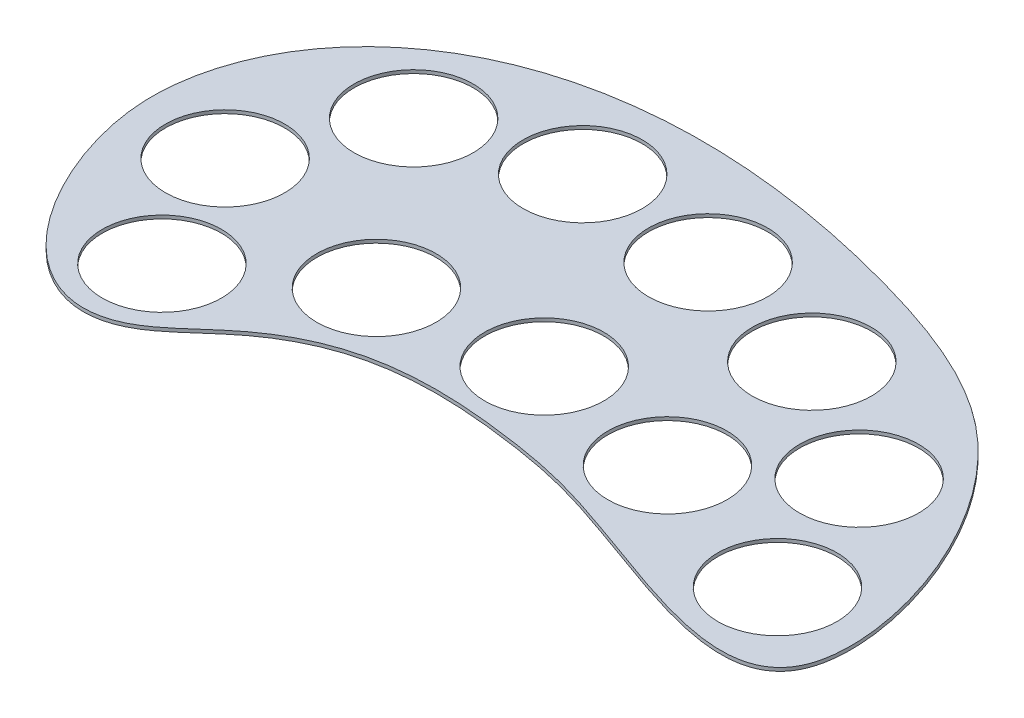
ISO-10303-21;
HEADER;
FILE_DESCRIPTION(('STEP AP214'),'2;1');
FILE_NAME('part.step','',(''),(''),'','','');
FILE_SCHEMA(('AUTOMOTIVE_DESIGN { 1 0 10303 214 1 1 1 1 }'));
ENDSEC;
DATA;
#1=APPLICATION_CONTEXT('core data for automotive mechanical design processes');
#2=APPLICATION_PROTOCOL_DEFINITION('international standard','automotive_design',2000,#1);
#3=PRODUCT_CONTEXT('',#1,'mechanical');
#4=PRODUCT('Part','Part','',(#3));
#5=PRODUCT_RELATED_PRODUCT_CATEGORY('part','',(#4));
#6=PRODUCT_DEFINITION_FORMATION('','',#4);
#7=PRODUCT_DEFINITION_CONTEXT('part definition',#1,'design');
#8=PRODUCT_DEFINITION('design','',#6,#7);
#9=PRODUCT_DEFINITION_SHAPE('','',#8);
#10=(LENGTH_UNIT() NAMED_UNIT(*) SI_UNIT(.MILLI.,.METRE.));
#11=(NAMED_UNIT(*) PLANE_ANGLE_UNIT() SI_UNIT($,.RADIAN.));
#12=(NAMED_UNIT(*) SI_UNIT($,.STERADIAN.) SOLID_ANGLE_UNIT());
#13=UNCERTAINTY_MEASURE_WITH_UNIT(LENGTH_MEASURE(1.E-05),#10,'distance_accuracy_value','');
#14=(GEOMETRIC_REPRESENTATION_CONTEXT(3) GLOBAL_UNCERTAINTY_ASSIGNED_CONTEXT((#13)) GLOBAL_UNIT_ASSIGNED_CONTEXT((#10,
#11,#12)) REPRESENTATION_CONTEXT('',''));
#15=CARTESIAN_POINT('',(0.,0.,0.));
#16=DIRECTION('',(0.,0.,1.));
#17=DIRECTION('',(1.,0.,0.));
#18=AXIS2_PLACEMENT_3D('',#15,#16,#17);
#19=CARTESIAN_POINT('',(684.135933031641,3.175,-50.0286677488228));
#20=DIRECTION('',(0.,1.,0.));
#21=DIRECTION('',(0.,0.,1.));
#22=AXIS2_PLACEMENT_3D('',#19,#20,#21);
#23=PLANE('',#22);
#24=CARTESIAN_POINT('',(710.382975865013,3.175,-120.032071340773));
#25=DIRECTION('',(0.,1.,0.));
#26=DIRECTION('',(0.,0.,1.));
#27=AXIS2_PLACEMENT_3D('',#24,#25,#26);
#28=CIRCLE('',#27,55.8800000000001);
#29=CARTESIAN_POINT('',(710.382975865013,3.175,-64.1520713407733));
#30=VERTEX_POINT('',#29);
#31=EDGE_CURVE('E103',#30,#30,#28,.T.);
#32=ORIENTED_EDGE('',*,*,#31,.F.);
#33=EDGE_LOOP('',(#32));
#34=FACE_BOUND('',#33,.T.);
#35=CARTESIAN_POINT('',(543.435128324721,3.175,-319.215089932941));
#36=DIRECTION('',(0.,1.,0.));
#37=DIRECTION('',(0.,0.,1.));
#38=AXIS2_PLACEMENT_3D('',#35,#36,#37);
#39=CIRCLE('',#38,55.88);
#40=CARTESIAN_POINT('',(543.435128324721,3.175,-263.335089932941));
#41=VERTEX_POINT('',#40);
#42=EDGE_CURVE('E91',#41,#41,#39,.T.);
#43=ORIENTED_EDGE('',*,*,#42,.F.);
#44=EDGE_LOOP('',(#43));
#45=FACE_BOUND('',#44,.T.);
#46=CARTESIAN_POINT('',(421.949796134147,3.175,-189.836190597731));
#47=DIRECTION('',(0.,1.,0.));
#48=DIRECTION('',(0.,0.,1.));
#49=AXIS2_PLACEMENT_3D('',#46,#47,#48);
#50=CIRCLE('',#49,55.88);
#51=CARTESIAN_POINT('',(421.949796134147,3.175,-133.956190597731));
#52=VERTEX_POINT('',#51);
#53=EDGE_CURVE('E79',#52,#52,#50,.T.);
#54=ORIENTED_EDGE('',*,*,#53,.F.);
#55=EDGE_LOOP('',(#54));
#56=FACE_BOUND('',#55,.T.);
#57=CARTESIAN_POINT('',(283.803786214023,3.175,-364.017449024033));
#58=DIRECTION('',(0.,1.,0.));
#59=DIRECTION('',(0.,0.,1.));
#60=AXIS2_PLACEMENT_3D('',#57,#58,#59);
#61=CIRCLE('',#60,55.8800000000001);
#62=CARTESIAN_POINT('',(283.803786214023,3.175,-308.137449024033));
#63=VERTEX_POINT('',#62);
#64=EDGE_CURVE('E67',#63,#63,#61,.T.);
#65=ORIENTED_EDGE('',*,*,#64,.F.);
#66=EDGE_LOOP('',(#65));
#67=FACE_BOUND('',#66,.T.);
#68=CARTESIAN_POINT('',(159.211353128381,3.175,-330.134918328895));
#69=DIRECTION('',(0.,1.,0.));
#70=DIRECTION('',(0.,0.,1.));
#71=AXIS2_PLACEMENT_3D('',#68,#69,#70);
#72=CIRCLE('',#71,55.88);
#73=CARTESIAN_POINT('',(159.211353128381,3.175,-274.254918328895));
#74=VERTEX_POINT('',#73);
#75=EDGE_CURVE('E55',#74,#74,#72,.T.);
#76=ORIENTED_EDGE('',*,*,#75,.F.);
#77=EDGE_LOOP('',(#76));
#78=FACE_BOUND('',#77,.T.);
#79=CARTESIAN_POINT('',(18.90929656579,3.175,-218.738303536017));
#80=CARTESIAN_POINT('',(19.3137804175349,3.175,-207.303001363422));
#81=CARTESIAN_POINT('',(32.3627941964965,3.175,-105.603551285262));
#82=CARTESIAN_POINT('',(136.614276413427,3.175,37.6468143892049));
#83=CARTESIAN_POINT('',(287.885062402203,3.175,-119.177890449448));
#84=CARTESIAN_POINT('',(386.65177229118,3.175,-129.233236426815));
#85=CARTESIAN_POINT('',(593.931834544514,3.175,-92.5019488812406));
#86=CARTESIAN_POINT('',(863.777298493397,3.175,56.2509725707286));
#87=CARTESIAN_POINT('',(744.910717156489,3.175,-338.443232461618));
#88=CARTESIAN_POINT('',(183.656780139511,3.175,-538.233183068478));
#89=CARTESIAN_POINT('',(14.0176674492187,3.175,-357.031233706032));
#90=CARTESIAN_POINT('',(18.90929656579,3.175,-218.738303536017));
#91=B_SPLINE_CURVE_WITH_KNOTS('',3,(#79,#80,#81,#82,#83,#84,#85,#86,#87,#88,#89,#90),
.UNSPECIFIED.,.T.,.F.,(4,1,1,1,1,1,1,1,1,4),(0.,0.0247150068666619,0.222435061799958,
0.264927020809992,0.407142637956969,0.438731727428566,0.563040963382589,0.657412937436147,
0.701108841097887,0.999999999999997),.UNSPECIFIED.);
#92=CARTESIAN_POINT('',(18.90929656579,3.175,-218.738303536017));
#93=VERTEX_POINT('',#92);
#94=EDGE_CURVE('E10',#93,#93,#91,.T.);
#95=ORIENTED_EDGE('',*,*,#94,.T.);
#96=EDGE_LOOP('',(#95));
#97=FACE_BOUND('',#96,.T.);
#98=CARTESIAN_POINT('',(103.376977842753,3.175,-209.224559200817));
#99=DIRECTION('',(0.,1.,0.));
#100=DIRECTION('',(0.,0.,1.));
#101=AXIS2_PLACEMENT_3D('',#98,#99,#100);
#102=CIRCLE('',#101,55.88);
#103=CARTESIAN_POINT('',(103.376977842753,3.175,-153.344559200817));
#104=VERTEX_POINT('',#103);
#105=EDGE_CURVE('E44',#104,#104,#102,.T.);
#106=ORIENTED_EDGE('',*,*,#105,.F.);
#107=EDGE_LOOP('',(#106));
#108=FACE_BOUND('',#107,.T.);
#109=CARTESIAN_POINT('',(279.457854567624,3.175,-174.984117895221));
#110=DIRECTION('',(0.,1.,0.));
#111=DIRECTION('',(0.,0.,1.));
#112=AXIS2_PLACEMENT_3D('',#109,#110,#111);
#113=CIRCLE('',#112,55.88);
#114=CARTESIAN_POINT('',(279.457854567624,3.175,-119.104117895221));
#115=VERTEX_POINT('',#114);
#116=EDGE_CURVE('E61',#115,#115,#113,.T.);
#117=ORIENTED_EDGE('',*,*,#116,.F.);
#118=EDGE_LOOP('',(#117));
#119=FACE_BOUND('',#118,.T.);
#120=CARTESIAN_POINT('',(559.919680471523,3.175,-167.353163273532));
#121=DIRECTION('',(0.,1.,0.));
#122=DIRECTION('',(0.,0.,1.));
#123=AXIS2_PLACEMENT_3D('',#120,#121,#122);
#124=CIRCLE('',#123,55.8800000000001);
#125=CARTESIAN_POINT('',(559.919680471523,3.175,-111.473163273532));
#126=VERTEX_POINT('',#125);
#127=EDGE_CURVE('E73',#126,#126,#124,.T.);
#128=ORIENTED_EDGE('',*,*,#127,.F.);
#129=EDGE_LOOP('',(#128));
#130=FACE_BOUND('',#129,.T.);
#131=CARTESIAN_POINT('',(159.211353128381,3.175,-94.1120140955718));
#132=DIRECTION('',(0.,1.,0.));
#133=DIRECTION('',(0.,0.,1.));
#134=AXIS2_PLACEMENT_3D('',#131,#132,#133);
#135=CIRCLE('',#134,55.88);
#136=CARTESIAN_POINT('',(159.211353128381,3.175,-38.2320140955718));
#137=VERTEX_POINT('',#136);
#138=EDGE_CURVE('E85',#137,#137,#135,.T.);
#139=ORIENTED_EDGE('',*,*,#138,.F.);
#140=EDGE_LOOP('',(#139));
#141=FACE_BOUND('',#140,.T.);
#142=CARTESIAN_POINT('',(414.188977652437,3.175,-351.229411635359));
#143=DIRECTION('',(0.,1.,0.));
#144=DIRECTION('',(0.,0.,1.));
#145=AXIS2_PLACEMENT_3D('',#142,#143,#144);
#146=CIRCLE('',#145,55.8800000000001);
#147=CARTESIAN_POINT('',(414.188977652437,3.175,-295.349411635359));
#148=VERTEX_POINT('',#147);
#149=EDGE_CURVE('E97',#148,#148,#146,.T.);
#150=ORIENTED_EDGE('',*,*,#149,.F.);
#151=EDGE_LOOP('',(#150));
#152=FACE_BOUND('',#151,.T.);
#153=CARTESIAN_POINT('',(660.583586304874,3.175,-246.394891073436));
#154=DIRECTION('',(0.,1.,0.));
#155=DIRECTION('',(0.,0.,1.));
#156=AXIS2_PLACEMENT_3D('',#153,#154,#155);
#157=CIRCLE('',#156,55.8800000000001);
#158=CARTESIAN_POINT('',(660.583586304874,3.175,-190.514891073436));
#159=VERTEX_POINT('',#158);
#160=EDGE_CURVE('E109',#159,#159,#157,.T.);
#161=ORIENTED_EDGE('',*,*,#160,.F.);
#162=EDGE_LOOP('',(#161));
#163=FACE_BOUND('',#162,.T.);
#164=ADVANCED_FACE('F31',(#34,#45,#56,#67,#78,#97,#108,#119,#130,#141,#152,#163),#23,.T.);
#165=CARTESIAN_POINT('',(684.135933031641,0.,-50.0286677488228));
#166=DIRECTION('',(0.,1.,0.));
#167=DIRECTION('',(0.,0.,1.));
#168=AXIS2_PLACEMENT_3D('',#165,#166,#167);
#169=PLANE('',#168);
#170=CARTESIAN_POINT('',(710.382975865013,0.,-120.032071340773));
#171=DIRECTION('',(0.,1.,0.));
#172=DIRECTION('',(0.,0.,1.));
#173=AXIS2_PLACEMENT_3D('',#170,#171,#172);
#174=CIRCLE('',#173,55.8800000000001);
#175=CARTESIAN_POINT('',(710.382975865013,0.,-64.1520713407733));
#176=VERTEX_POINT('',#175);
#177=EDGE_CURVE('E106',#176,#176,#174,.T.);
#178=ORIENTED_EDGE('',*,*,#177,.T.);
#179=EDGE_LOOP('',(#178));
#180=FACE_BOUND('',#179,.T.);
#181=CARTESIAN_POINT('',(543.435128324721,0.,-319.215089932941));
#182=DIRECTION('',(0.,1.,0.));
#183=DIRECTION('',(0.,0.,1.));
#184=AXIS2_PLACEMENT_3D('',#181,#182,#183);
#185=CIRCLE('',#184,55.88);
#186=CARTESIAN_POINT('',(543.435128324721,0.,-263.335089932941));
#187=VERTEX_POINT('',#186);
#188=EDGE_CURVE('E94',#187,#187,#185,.T.);
#189=ORIENTED_EDGE('',*,*,#188,.T.);
#190=EDGE_LOOP('',(#189));
#191=FACE_BOUND('',#190,.T.);
#192=CARTESIAN_POINT('',(421.949796134147,0.,-189.836190597731));
#193=DIRECTION('',(0.,1.,0.));
#194=DIRECTION('',(0.,0.,1.));
#195=AXIS2_PLACEMENT_3D('',#192,#193,#194);
#196=CIRCLE('',#195,55.88);
#197=CARTESIAN_POINT('',(421.949796134147,0.,-133.956190597731));
#198=VERTEX_POINT('',#197);
#199=EDGE_CURVE('E82',#198,#198,#196,.T.);
#200=ORIENTED_EDGE('',*,*,#199,.T.);
#201=EDGE_LOOP('',(#200));
#202=FACE_BOUND('',#201,.T.);
#203=CARTESIAN_POINT('',(283.803786214023,0.,-364.017449024033));
#204=DIRECTION('',(0.,1.,0.));
#205=DIRECTION('',(0.,0.,1.));
#206=AXIS2_PLACEMENT_3D('',#203,#204,#205);
#207=CIRCLE('',#206,55.8800000000001);
#208=CARTESIAN_POINT('',(283.803786214023,0.,-308.137449024033));
#209=VERTEX_POINT('',#208);
#210=EDGE_CURVE('E70',#209,#209,#207,.T.);
#211=ORIENTED_EDGE('',*,*,#210,.T.);
#212=EDGE_LOOP('',(#211));
#213=FACE_BOUND('',#212,.T.);
#214=CARTESIAN_POINT('',(159.211353128381,0.,-330.134918328895));
#215=DIRECTION('',(0.,1.,0.));
#216=DIRECTION('',(0.,0.,1.));
#217=AXIS2_PLACEMENT_3D('',#214,#215,#216);
#218=CIRCLE('',#217,55.88);
#219=CARTESIAN_POINT('',(159.211353128381,0.,-274.254918328895));
#220=VERTEX_POINT('',#219);
#221=EDGE_CURVE('E58',#220,#220,#218,.T.);
#222=ORIENTED_EDGE('',*,*,#221,.T.);
#223=EDGE_LOOP('',(#222));
#224=FACE_BOUND('',#223,.T.);
#225=CARTESIAN_POINT('',(18.90929656579,0.,-218.738303536017));
#226=CARTESIAN_POINT('',(19.3137804175349,0.,-207.303001363422));
#227=CARTESIAN_POINT('',(32.3627941964965,0.,-105.603551285262));
#228=CARTESIAN_POINT('',(136.614276413427,0.,37.6468143892049));
#229=CARTESIAN_POINT('',(287.885062402203,0.,-119.177890449448));
#230=CARTESIAN_POINT('',(386.65177229118,0.,-129.233236426815));
#231=CARTESIAN_POINT('',(593.931834544514,0.,-92.5019488812406));
#232=CARTESIAN_POINT('',(863.777298493397,0.,56.2509725707286));
#233=CARTESIAN_POINT('',(744.910717156489,0.,-338.443232461618));
#234=CARTESIAN_POINT('',(183.656780139511,0.,-538.233183068478));
#235=CARTESIAN_POINT('',(14.0176674492187,0.,-357.031233706032));
#236=CARTESIAN_POINT('',(18.90929656579,0.,-218.738303536017));
#237=B_SPLINE_CURVE_WITH_KNOTS('',3,(#225,#226,#227,#228,#229,#230,#231,#232,#233,#234,#235,
#236),.UNSPECIFIED.,.T.,.F.,(4,1,1,1,1,1,1,1,1,4),(0.,0.0247150068666619,0.222435061799958,
0.264927020809992,0.407142637956969,0.438731727428566,0.563040963382589,0.657412937436147,
0.701108841097887,0.999999999999997),.UNSPECIFIED.);
#238=CARTESIAN_POINT('',(18.90929656579,0.,-218.738303536017));
#239=VERTEX_POINT('',#238);
#240=EDGE_CURVE('E36',#239,#239,#237,.T.);
#241=ORIENTED_EDGE('',*,*,#240,.F.);
#242=EDGE_LOOP('',(#241));
#243=FACE_BOUND('',#242,.T.);
#244=CARTESIAN_POINT('',(103.376977842753,0.,-209.224559200817));
#245=DIRECTION('',(0.,1.,0.));
#246=DIRECTION('',(0.,0.,1.));
#247=AXIS2_PLACEMENT_3D('',#244,#245,#246);
#248=CIRCLE('',#247,55.88);
#249=CARTESIAN_POINT('',(103.376977842753,0.,-153.344559200817));
#250=VERTEX_POINT('',#249);
#251=EDGE_CURVE('E49',#250,#250,#248,.T.);
#252=ORIENTED_EDGE('',*,*,#251,.T.);
#253=EDGE_LOOP('',(#252));
#254=FACE_BOUND('',#253,.T.);
#255=CARTESIAN_POINT('',(279.457854567624,0.,-174.984117895221));
#256=DIRECTION('',(0.,1.,0.));
#257=DIRECTION('',(0.,0.,1.));
#258=AXIS2_PLACEMENT_3D('',#255,#256,#257);
#259=CIRCLE('',#258,55.88);
#260=CARTESIAN_POINT('',(279.457854567624,0.,-119.104117895221));
#261=VERTEX_POINT('',#260);
#262=EDGE_CURVE('E64',#261,#261,#259,.T.);
#263=ORIENTED_EDGE('',*,*,#262,.T.);
#264=EDGE_LOOP('',(#263));
#265=FACE_BOUND('',#264,.T.);
#266=CARTESIAN_POINT('',(559.919680471523,0.,-167.353163273532));
#267=DIRECTION('',(0.,1.,0.));
#268=DIRECTION('',(0.,0.,1.));
#269=AXIS2_PLACEMENT_3D('',#266,#267,#268);
#270=CIRCLE('',#269,55.8800000000001);
#271=CARTESIAN_POINT('',(559.919680471523,0.,-111.473163273532));
#272=VERTEX_POINT('',#271);
#273=EDGE_CURVE('E76',#272,#272,#270,.T.);
#274=ORIENTED_EDGE('',*,*,#273,.T.);
#275=EDGE_LOOP('',(#274));
#276=FACE_BOUND('',#275,.T.);
#277=CARTESIAN_POINT('',(159.211353128381,0.,-94.1120140955718));
#278=DIRECTION('',(0.,1.,0.));
#279=DIRECTION('',(0.,0.,1.));
#280=AXIS2_PLACEMENT_3D('',#277,#278,#279);
#281=CIRCLE('',#280,55.88);
#282=CARTESIAN_POINT('',(159.211353128381,0.,-38.2320140955718));
#283=VERTEX_POINT('',#282);
#284=EDGE_CURVE('E88',#283,#283,#281,.T.);
#285=ORIENTED_EDGE('',*,*,#284,.T.);
#286=EDGE_LOOP('',(#285));
#287=FACE_BOUND('',#286,.T.);
#288=CARTESIAN_POINT('',(414.188977652437,0.,-351.229411635359));
#289=DIRECTION('',(0.,1.,0.));
#290=DIRECTION('',(0.,0.,1.));
#291=AXIS2_PLACEMENT_3D('',#288,#289,#290);
#292=CIRCLE('',#291,55.8800000000001);
#293=CARTESIAN_POINT('',(414.188977652437,0.,-295.349411635359));
#294=VERTEX_POINT('',#293);
#295=EDGE_CURVE('E100',#294,#294,#292,.T.);
#296=ORIENTED_EDGE('',*,*,#295,.T.);
#297=EDGE_LOOP('',(#296));
#298=FACE_BOUND('',#297,.T.);
#299=CARTESIAN_POINT('',(660.583586304874,0.,-246.394891073436));
#300=DIRECTION('',(0.,1.,0.));
#301=DIRECTION('',(0.,0.,1.));
#302=AXIS2_PLACEMENT_3D('',#299,#300,#301);
#303=CIRCLE('',#302,55.8800000000001);
#304=CARTESIAN_POINT('',(660.583586304874,0.,-190.514891073436));
#305=VERTEX_POINT('',#304);
#306=EDGE_CURVE('E112',#305,#305,#303,.T.);
#307=ORIENTED_EDGE('',*,*,#306,.T.);
#308=EDGE_LOOP('',(#307));
#309=FACE_BOUND('',#308,.T.);
#310=ADVANCED_FACE('F122',(#180,#191,#202,#213,#224,#243,#254,#265,#276,#287,#298,#309),#169,.F.);
#311=DIRECTION('',(0.,-1.,0.));
#312=VECTOR('',#311,1.);
#313=SURFACE_OF_LINEAR_EXTRUSION('',#91,#312);
#314=ORIENTED_EDGE('',*,*,#94,.F.);
#315=EDGE_LOOP('',(#314));
#316=FACE_BOUND('',#315,.T.);
#317=ORIENTED_EDGE('',*,*,#240,.T.);
#318=EDGE_LOOP('',(#317));
#319=FACE_BOUND('',#318,.T.);
#320=ADVANCED_FACE('F33',(#316,#319),#313,.F.);
#321=CARTESIAN_POINT('',(103.376977842753,3.175,-209.224559200817));
#322=DIRECTION('',(0.,-1.,0.));
#323=DIRECTION('',(0.,0.,-1.));
#324=AXIS2_PLACEMENT_3D('',#321,#322,#323);
#325=CYLINDRICAL_SURFACE('',#324,55.88);
#326=ORIENTED_EDGE('',*,*,#105,.T.);
#327=EDGE_LOOP('',(#326));
#328=FACE_BOUND('',#327,.T.);
#329=ORIENTED_EDGE('',*,*,#251,.F.);
#330=EDGE_LOOP('',(#329));
#331=FACE_BOUND('',#330,.T.);
#332=ADVANCED_FACE('F132',(#328,#331),#325,.F.);
#333=CARTESIAN_POINT('',(159.211353128381,3.175,-330.134918328895));
#334=DIRECTION('',(0.,-1.,0.));
#335=DIRECTION('',(0.,0.,-1.));
#336=AXIS2_PLACEMENT_3D('',#333,#334,#335);
#337=CYLINDRICAL_SURFACE('',#336,55.88);
#338=ORIENTED_EDGE('',*,*,#75,.T.);
#339=EDGE_LOOP('',(#338));
#340=FACE_BOUND('',#339,.T.);
#341=ORIENTED_EDGE('',*,*,#221,.F.);
#342=EDGE_LOOP('',(#341));
#343=FACE_BOUND('',#342,.T.);
#344=ADVANCED_FACE('F135',(#340,#343),#337,.F.);
#345=CARTESIAN_POINT('',(279.457854567624,3.175,-174.984117895221));
#346=DIRECTION('',(0.,-1.,0.));
#347=DIRECTION('',(0.,0.,-1.));
#348=AXIS2_PLACEMENT_3D('',#345,#346,#347);
#349=CYLINDRICAL_SURFACE('',#348,55.88);
#350=ORIENTED_EDGE('',*,*,#116,.T.);
#351=EDGE_LOOP('',(#350));
#352=FACE_BOUND('',#351,.T.);
#353=ORIENTED_EDGE('',*,*,#262,.F.);
#354=EDGE_LOOP('',(#353));
#355=FACE_BOUND('',#354,.T.);
#356=ADVANCED_FACE('F139',(#352,#355),#349,.F.);
#357=CARTESIAN_POINT('',(283.803786214023,3.175,-364.017449024033));
#358=DIRECTION('',(0.,-1.,0.));
#359=DIRECTION('',(0.,0.,-1.));
#360=AXIS2_PLACEMENT_3D('',#357,#358,#359);
#361=CYLINDRICAL_SURFACE('',#360,55.8800000000001);
#362=ORIENTED_EDGE('',*,*,#64,.T.);
#363=EDGE_LOOP('',(#362));
#364=FACE_BOUND('',#363,.T.);
#365=ORIENTED_EDGE('',*,*,#210,.F.);
#366=EDGE_LOOP('',(#365));
#367=FACE_BOUND('',#366,.T.);
#368=ADVANCED_FACE('F143',(#364,#367),#361,.F.);
#369=CARTESIAN_POINT('',(559.919680471523,3.175,-167.353163273532));
#370=DIRECTION('',(0.,-1.,0.));
#371=DIRECTION('',(0.,0.,-1.));
#372=AXIS2_PLACEMENT_3D('',#369,#370,#371);
#373=CYLINDRICAL_SURFACE('',#372,55.8800000000001);
#374=ORIENTED_EDGE('',*,*,#127,.T.);
#375=EDGE_LOOP('',(#374));
#376=FACE_BOUND('',#375,.T.);
#377=ORIENTED_EDGE('',*,*,#273,.F.);
#378=EDGE_LOOP('',(#377));
#379=FACE_BOUND('',#378,.T.);
#380=ADVANCED_FACE('F147',(#376,#379),#373,.F.);
#381=CARTESIAN_POINT('',(421.949796134147,3.175,-189.836190597731));
#382=DIRECTION('',(0.,-1.,0.));
#383=DIRECTION('',(0.,0.,-1.));
#384=AXIS2_PLACEMENT_3D('',#381,#382,#383);
#385=CYLINDRICAL_SURFACE('',#384,55.88);
#386=ORIENTED_EDGE('',*,*,#53,.T.);
#387=EDGE_LOOP('',(#386));
#388=FACE_BOUND('',#387,.T.);
#389=ORIENTED_EDGE('',*,*,#199,.F.);
#390=EDGE_LOOP('',(#389));
#391=FACE_BOUND('',#390,.T.);
#392=ADVANCED_FACE('F151',(#388,#391),#385,.F.);
#393=CARTESIAN_POINT('',(159.211353128381,3.175,-94.1120140955718));
#394=DIRECTION('',(0.,-1.,0.));
#395=DIRECTION('',(0.,0.,-1.));
#396=AXIS2_PLACEMENT_3D('',#393,#394,#395);
#397=CYLINDRICAL_SURFACE('',#396,55.88);
#398=ORIENTED_EDGE('',*,*,#138,.T.);
#399=EDGE_LOOP('',(#398));
#400=FACE_BOUND('',#399,.T.);
#401=ORIENTED_EDGE('',*,*,#284,.F.);
#402=EDGE_LOOP('',(#401));
#403=FACE_BOUND('',#402,.T.);
#404=ADVANCED_FACE('F155',(#400,#403),#397,.F.);
#405=CARTESIAN_POINT('',(543.435128324721,3.175,-319.215089932941));
#406=DIRECTION('',(0.,-1.,0.));
#407=DIRECTION('',(0.,0.,-1.));
#408=AXIS2_PLACEMENT_3D('',#405,#406,#407);
#409=CYLINDRICAL_SURFACE('',#408,55.88);
#410=ORIENTED_EDGE('',*,*,#42,.T.);
#411=EDGE_LOOP('',(#410));
#412=FACE_BOUND('',#411,.T.);
#413=ORIENTED_EDGE('',*,*,#188,.F.);
#414=EDGE_LOOP('',(#413));
#415=FACE_BOUND('',#414,.T.);
#416=ADVANCED_FACE('F159',(#412,#415),#409,.F.);
#417=CARTESIAN_POINT('',(414.188977652437,3.175,-351.229411635359));
#418=DIRECTION('',(0.,-1.,0.));
#419=DIRECTION('',(0.,0.,-1.));
#420=AXIS2_PLACEMENT_3D('',#417,#418,#419);
#421=CYLINDRICAL_SURFACE('',#420,55.8800000000001);
#422=ORIENTED_EDGE('',*,*,#149,.T.);
#423=EDGE_LOOP('',(#422));
#424=FACE_BOUND('',#423,.T.);
#425=ORIENTED_EDGE('',*,*,#295,.F.);
#426=EDGE_LOOP('',(#425));
#427=FACE_BOUND('',#426,.T.);
#428=ADVANCED_FACE('F163',(#424,#427),#421,.F.);
#429=CARTESIAN_POINT('',(710.382975865013,3.175,-120.032071340773));
#430=DIRECTION('',(0.,-1.,0.));
#431=DIRECTION('',(0.,0.,-1.));
#432=AXIS2_PLACEMENT_3D('',#429,#430,#431);
#433=CYLINDRICAL_SURFACE('',#432,55.8800000000001);
#434=ORIENTED_EDGE('',*,*,#31,.T.);
#435=EDGE_LOOP('',(#434));
#436=FACE_BOUND('',#435,.T.);
#437=ORIENTED_EDGE('',*,*,#177,.F.);
#438=EDGE_LOOP('',(#437));
#439=FACE_BOUND('',#438,.T.);
#440=ADVANCED_FACE('F167',(#436,#439),#433,.F.);
#441=CARTESIAN_POINT('',(660.583586304874,3.175,-246.394891073436));
#442=DIRECTION('',(0.,-1.,0.));
#443=DIRECTION('',(0.,0.,-1.));
#444=AXIS2_PLACEMENT_3D('',#441,#442,#443);
#445=CYLINDRICAL_SURFACE('',#444,55.8800000000001);
#446=ORIENTED_EDGE('',*,*,#160,.T.);
#447=EDGE_LOOP('',(#446));
#448=FACE_BOUND('',#447,.T.);
#449=ORIENTED_EDGE('',*,*,#306,.F.);
#450=EDGE_LOOP('',(#449));
#451=FACE_BOUND('',#450,.T.);
#452=ADVANCED_FACE('F118',(#448,#451),#445,.F.);
#453=CLOSED_SHELL('',(#164,#310,#320,#332,#344,#356,#368,#380,#392,#404,#416,#428,#440,#452));
#454=MANIFOLD_SOLID_BREP('B2',#453);
#455=ADVANCED_BREP_SHAPE_REPRESENTATION('',(#18,#454),#14);
#456=SHAPE_DEFINITION_REPRESENTATION(#9,#455);
ENDSEC;
END-ISO-10303-21;
